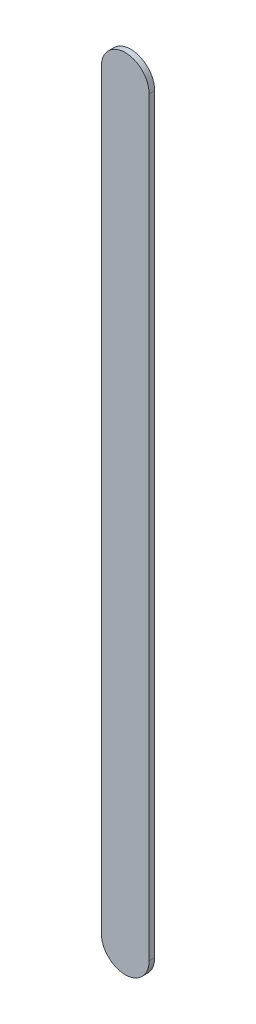
ISO-10303-21;
HEADER;
FILE_DESCRIPTION(('STEP AP214'),'2;1');
FILE_NAME('part.step','',(''),(''),'','','');
FILE_SCHEMA(('AUTOMOTIVE_DESIGN { 1 0 10303 214 1 1 1 1 }'));
ENDSEC;
DATA;
#1=APPLICATION_CONTEXT('core data for automotive mechanical design processes');
#2=APPLICATION_PROTOCOL_DEFINITION('international standard','automotive_design',2000,#1);
#3=PRODUCT_CONTEXT('',#1,'mechanical');
#4=PRODUCT('Part','Part','',(#3));
#5=PRODUCT_RELATED_PRODUCT_CATEGORY('part','',(#4));
#6=PRODUCT_DEFINITION_FORMATION('','',#4);
#7=PRODUCT_DEFINITION_CONTEXT('part definition',#1,'design');
#8=PRODUCT_DEFINITION('design','',#6,#7);
#9=PRODUCT_DEFINITION_SHAPE('','',#8);
#10=(LENGTH_UNIT() NAMED_UNIT(*) SI_UNIT(.MILLI.,.METRE.));
#11=(NAMED_UNIT(*) PLANE_ANGLE_UNIT() SI_UNIT($,.RADIAN.));
#12=(NAMED_UNIT(*) SI_UNIT($,.STERADIAN.) SOLID_ANGLE_UNIT());
#13=UNCERTAINTY_MEASURE_WITH_UNIT(LENGTH_MEASURE(1.E-05),#10,'distance_accuracy_value','');
#14=(GEOMETRIC_REPRESENTATION_CONTEXT(3) GLOBAL_UNCERTAINTY_ASSIGNED_CONTEXT((#13)) GLOBAL_UNIT_ASSIGNED_CONTEXT((#10,
#11,#12)) REPRESENTATION_CONTEXT('',''));
#15=CARTESIAN_POINT('',(0.,0.,0.));
#16=DIRECTION('',(0.,0.,1.));
#17=DIRECTION('',(1.,0.,0.));
#18=AXIS2_PLACEMENT_3D('',#15,#16,#17);
#19=CARTESIAN_POINT('',(117.14,-56.97,1.635));
#20=DIRECTION('',(0.,0.,1.));
#21=DIRECTION('',(1.,0.,0.));
#22=AXIS2_PLACEMENT_3D('',#19,#20,#21);
#23=PLANE('',#22);
#24=DIRECTION('',(0.,1.,0.));
#25=VECTOR('',#24,1.);
#26=CARTESIAN_POINT('',(117.14,-56.97,1.635));
#27=LINE('',#26,#25);
#28=CARTESIAN_POINT('',(117.14,-56.97,1.635));
#29=VERTEX_POINT('',#28);
#30=CARTESIAN_POINT('',(117.14,-52.26,1.635));
#31=VERTEX_POINT('',#30);
#32=EDGE_CURVE('E91',#29,#31,#27,.T.);
#33=ORIENTED_EDGE('',*,*,#32,.T.);
#34=CARTESIAN_POINT('',(116.99,-52.26,1.635));
#35=DIRECTION('',(0.,0.,1.));
#36=DIRECTION('',(1.,0.,0.));
#37=AXIS2_PLACEMENT_3D('',#34,#35,#36);
#38=CIRCLE('',#37,0.15);
#39=CARTESIAN_POINT('',(116.84,-52.26,1.635));
#40=VERTEX_POINT('',#39);
#41=EDGE_CURVE('E72',#31,#40,#38,.T.);
#42=ORIENTED_EDGE('',*,*,#41,.T.);
#43=DIRECTION('',(0.,-1.,0.));
#44=VECTOR('',#43,1.);
#45=CARTESIAN_POINT('',(116.84,-52.26,1.635));
#46=LINE('',#45,#44);
#47=CARTESIAN_POINT('',(116.84,-56.97,1.635));
#48=VERTEX_POINT('',#47);
#49=EDGE_CURVE('E85',#40,#48,#46,.T.);
#50=ORIENTED_EDGE('',*,*,#49,.T.);
#51=CARTESIAN_POINT('',(116.99,-56.97,1.635));
#52=DIRECTION('',(0.,0.,1.));
#53=DIRECTION('',(-1.,0.,0.));
#54=AXIS2_PLACEMENT_3D('',#51,#52,#53);
#55=CIRCLE('',#54,0.15);
#56=EDGE_CURVE('E11',#48,#29,#55,.T.);
#57=ORIENTED_EDGE('',*,*,#56,.T.);
#58=EDGE_LOOP('',(#33,#42,#50,#57));
#59=FACE_BOUND('',#58,.T.);
#60=ADVANCED_FACE('F17',(#59),#23,.T.);
#61=CARTESIAN_POINT('',(117.14,-56.97,1.6));
#62=DIRECTION('',(0.,0.,1.));
#63=DIRECTION('',(1.,0.,0.));
#64=AXIS2_PLACEMENT_3D('',#61,#62,#63);
#65=PLANE('',#64);
#66=CARTESIAN_POINT('',(116.99,-56.97,1.6));
#67=DIRECTION('',(0.,0.,1.));
#68=DIRECTION('',(-1.,0.,0.));
#69=AXIS2_PLACEMENT_3D('',#66,#67,#68);
#70=CIRCLE('',#69,0.15);
#71=CARTESIAN_POINT('',(116.84,-56.97,1.6));
#72=VERTEX_POINT('',#71);
#73=CARTESIAN_POINT('',(117.14,-56.97,1.6));
#74=VERTEX_POINT('',#73);
#75=EDGE_CURVE('E25',#72,#74,#70,.T.);
#76=ORIENTED_EDGE('',*,*,#75,.F.);
#77=DIRECTION('',(0.,-1.,0.));
#78=VECTOR('',#77,1.);
#79=CARTESIAN_POINT('',(116.84,-52.26,1.6));
#80=LINE('',#79,#78);
#81=CARTESIAN_POINT('',(116.84,-52.26,1.6));
#82=VERTEX_POINT('',#81);
#83=EDGE_CURVE('E57',#82,#72,#80,.T.);
#84=ORIENTED_EDGE('',*,*,#83,.F.);
#85=CARTESIAN_POINT('',(116.99,-52.26,1.6));
#86=DIRECTION('',(0.,0.,1.));
#87=DIRECTION('',(1.,0.,0.));
#88=AXIS2_PLACEMENT_3D('',#85,#86,#87);
#89=CIRCLE('',#88,0.15);
#90=CARTESIAN_POINT('',(117.14,-52.26,1.6));
#91=VERTEX_POINT('',#90);
#92=EDGE_CURVE('E93',#91,#82,#89,.T.);
#93=ORIENTED_EDGE('',*,*,#92,.F.);
#94=DIRECTION('',(0.,1.,0.));
#95=VECTOR('',#94,1.);
#96=CARTESIAN_POINT('',(117.14,-56.97,1.6));
#97=LINE('',#96,#95);
#98=EDGE_CURVE('E90',#74,#91,#97,.T.);
#99=ORIENTED_EDGE('',*,*,#98,.F.);
#100=EDGE_LOOP('',(#76,#84,#93,#99));
#101=FACE_BOUND('',#100,.T.);
#102=ADVANCED_FACE('F95',(#101),#65,.F.);
#103=CARTESIAN_POINT('',(116.99,-56.97,1.6));
#104=DIRECTION('',(0.,0.,-1.));
#105=DIRECTION('',(-1.,0.,0.));
#106=AXIS2_PLACEMENT_3D('',#103,#104,#105);
#107=CYLINDRICAL_SURFACE('',#106,0.15);
#108=ORIENTED_EDGE('',*,*,#75,.T.);
#109=DIRECTION('',(0.,0.,1.));
#110=VECTOR('',#109,1.);
#111=CARTESIAN_POINT('',(117.14,-56.97,1.6));
#112=LINE('',#111,#110);
#113=EDGE_CURVE('E80',#74,#29,#112,.T.);
#114=ORIENTED_EDGE('',*,*,#113,.T.);
#115=ORIENTED_EDGE('',*,*,#56,.F.);
#116=DIRECTION('',(0.,0.,1.));
#117=VECTOR('',#116,1.);
#118=CARTESIAN_POINT('',(116.84,-56.97,1.6));
#119=LINE('',#118,#117);
#120=EDGE_CURVE('E83',#72,#48,#119,.T.);
#121=ORIENTED_EDGE('',*,*,#120,.F.);
#122=EDGE_LOOP('',(#108,#114,#115,#121));
#123=FACE_BOUND('',#122,.T.);
#124=ADVANCED_FACE('F79',(#123),#107,.T.);
#125=CARTESIAN_POINT('',(116.84,-52.26,1.6));
#126=DIRECTION('',(1.,0.,0.));
#127=DIRECTION('',(0.,1.,0.));
#128=AXIS2_PLACEMENT_3D('',#125,#126,#127);
#129=PLANE('',#128);
#130=ORIENTED_EDGE('',*,*,#83,.T.);
#131=ORIENTED_EDGE('',*,*,#120,.T.);
#132=ORIENTED_EDGE('',*,*,#49,.F.);
#133=DIRECTION('',(0.,0.,1.));
#134=VECTOR('',#133,1.);
#135=CARTESIAN_POINT('',(116.84,-52.26,1.6));
#136=LINE('',#135,#134);
#137=EDGE_CURVE('E112',#82,#40,#136,.T.);
#138=ORIENTED_EDGE('',*,*,#137,.F.);
#139=EDGE_LOOP('',(#130,#131,#132,#138));
#140=FACE_BOUND('',#139,.T.);
#141=ADVANCED_FACE('F123',(#140),#129,.F.);
#142=CARTESIAN_POINT('',(116.99,-52.26,1.6));
#143=DIRECTION('',(0.,0.,-1.));
#144=DIRECTION('',(1.,0.,0.));
#145=AXIS2_PLACEMENT_3D('',#142,#143,#144);
#146=CYLINDRICAL_SURFACE('',#145,0.15);
#147=ORIENTED_EDGE('',*,*,#92,.T.);
#148=ORIENTED_EDGE('',*,*,#137,.T.);
#149=ORIENTED_EDGE('',*,*,#41,.F.);
#150=DIRECTION('',(0.,0.,1.));
#151=VECTOR('',#150,1.);
#152=CARTESIAN_POINT('',(117.14,-52.26,1.6));
#153=LINE('',#152,#151);
#154=EDGE_CURVE('E98',#91,#31,#153,.T.);
#155=ORIENTED_EDGE('',*,*,#154,.F.);
#156=EDGE_LOOP('',(#147,#148,#149,#155));
#157=FACE_BOUND('',#156,.T.);
#158=ADVANCED_FACE('F124',(#157),#146,.T.);
#159=CARTESIAN_POINT('',(117.14,-56.97,1.6));
#160=DIRECTION('',(-1.,0.,0.));
#161=DIRECTION('',(0.,0.,1.));
#162=AXIS2_PLACEMENT_3D('',#159,#160,#161);
#163=PLANE('',#162);
#164=ORIENTED_EDGE('',*,*,#98,.T.);
#165=ORIENTED_EDGE('',*,*,#154,.T.);
#166=ORIENTED_EDGE('',*,*,#32,.F.);
#167=ORIENTED_EDGE('',*,*,#113,.F.);
#168=EDGE_LOOP('',(#164,#165,#166,#167));
#169=FACE_BOUND('',#168,.T.);
#170=ADVANCED_FACE('F88',(#169),#163,.F.);
#171=CLOSED_SHELL('',(#60,#102,#124,#141,#158,#170));
#172=MANIFOLD_SOLID_BREP('B1',#171);
#173=ADVANCED_BREP_SHAPE_REPRESENTATION('',(#18,#172),#14);
#174=SHAPE_DEFINITION_REPRESENTATION(#9,#173);
ENDSEC;
END-ISO-10303-21;
